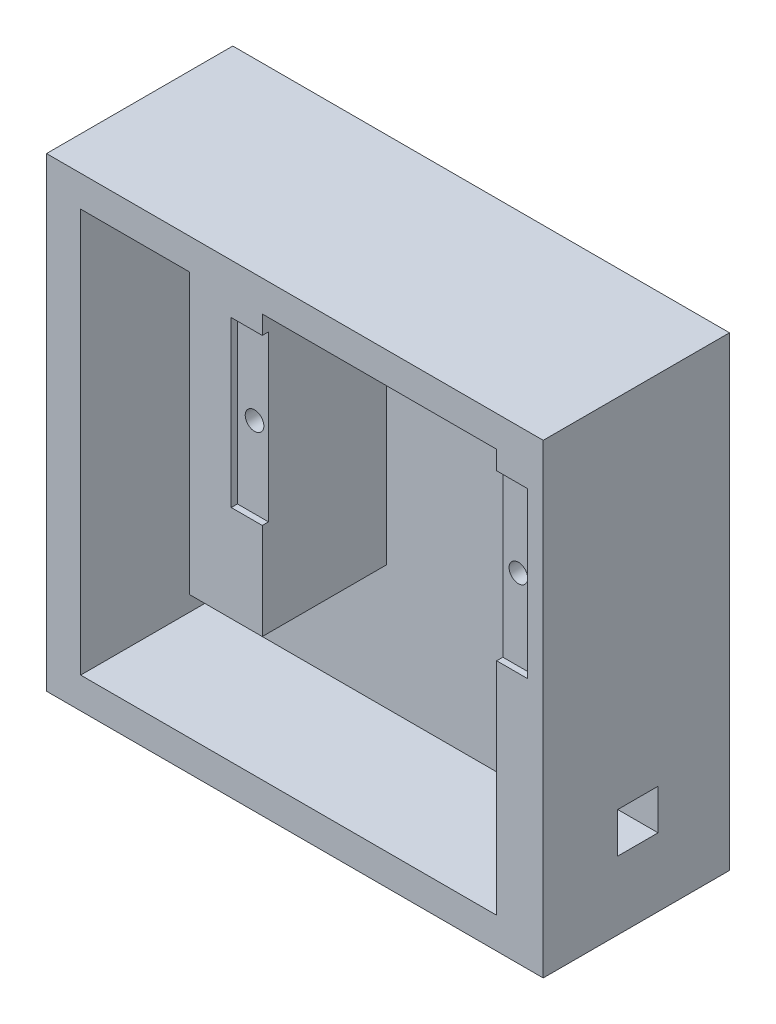
ISO-10303-21;
HEADER;
FILE_DESCRIPTION(('STEP AP214'),'2;1');
FILE_NAME('part.step','',(''),(''),'','','');
FILE_SCHEMA(('AUTOMOTIVE_DESIGN { 1 0 10303 214 1 1 1 1 }'));
ENDSEC;
DATA;
#1=APPLICATION_CONTEXT('core data for automotive mechanical design processes');
#2=APPLICATION_PROTOCOL_DEFINITION('international standard','automotive_design',2000,#1);
#3=PRODUCT_CONTEXT('',#1,'mechanical');
#4=PRODUCT('Part','Part','',(#3));
#5=PRODUCT_RELATED_PRODUCT_CATEGORY('part','',(#4));
#6=PRODUCT_DEFINITION_FORMATION('','',#4);
#7=PRODUCT_DEFINITION_CONTEXT('part definition',#1,'design');
#8=PRODUCT_DEFINITION('design','',#6,#7);
#9=PRODUCT_DEFINITION_SHAPE('','',#8);
#10=(LENGTH_UNIT() NAMED_UNIT(*) SI_UNIT(.MILLI.,.METRE.));
#11=(NAMED_UNIT(*) PLANE_ANGLE_UNIT() SI_UNIT($,.RADIAN.));
#12=(NAMED_UNIT(*) SI_UNIT($,.STERADIAN.) SOLID_ANGLE_UNIT());
#13=UNCERTAINTY_MEASURE_WITH_UNIT(LENGTH_MEASURE(1.E-05),#10,'distance_accuracy_value','');
#14=(GEOMETRIC_REPRESENTATION_CONTEXT(3) GLOBAL_UNCERTAINTY_ASSIGNED_CONTEXT((#13)) GLOBAL_UNIT_ASSIGNED_CONTEXT((#10,
#11,#12)) REPRESENTATION_CONTEXT('',''));
#15=CARTESIAN_POINT('',(0.,0.,0.));
#16=DIRECTION('',(0.,0.,1.));
#17=DIRECTION('',(1.,0.,0.));
#18=AXIS2_PLACEMENT_3D('',#15,#16,#17);
#19=CARTESIAN_POINT('',(-9.99999999999998,-43.,-8.48528137423857));
#20=DIRECTION('',(0.,0.,1.));
#21=DIRECTION('',(1.,0.,0.));
#22=AXIS2_PLACEMENT_3D('',#19,#20,#21);
#23=CYLINDRICAL_SURFACE('',#22,3.);
#24=CARTESIAN_POINT('',(-9.99999999999998,-43.,0.));
#25=DIRECTION('',(0.,0.,-1.));
#26=DIRECTION('',(-1.,0.,0.));
#27=AXIS2_PLACEMENT_3D('',#24,#25,#26);
#28=CIRCLE('',#27,3.);
#29=CARTESIAN_POINT('',(-13.,-43.,0.));
#30=VERTEX_POINT('',#29);
#31=EDGE_CURVE('E299',#30,#30,#28,.F.);
#32=ORIENTED_EDGE('',*,*,#31,.F.);
#33=EDGE_LOOP('',(#32));
#34=FACE_BOUND('',#33,.T.);
#35=CARTESIAN_POINT('',(-9.99999999999998,-43.,58.));
#36=DIRECTION('',(0.,0.,1.));
#37=DIRECTION('',(1.,0.,0.));
#38=AXIS2_PLACEMENT_3D('',#35,#36,#37);
#39=CIRCLE('',#38,3.);
#40=CARTESIAN_POINT('',(-6.99999999999998,-43.,58.));
#41=VERTEX_POINT('',#40);
#42=EDGE_CURVE('E39',#41,#41,#39,.F.);
#43=ORIENTED_EDGE('',*,*,#42,.F.);
#44=EDGE_LOOP('',(#43));
#45=FACE_BOUND('',#44,.T.);
#46=ADVANCED_FACE('F35',(#34,#45),#23,.F.);
#47=CARTESIAN_POINT('',(-95.,-43.,-8.48528137423857));
#48=DIRECTION('',(0.,0.,1.));
#49=DIRECTION('',(1.,0.,0.));
#50=AXIS2_PLACEMENT_3D('',#47,#48,#49);
#51=CYLINDRICAL_SURFACE('',#50,2.99999999999999);
#52=CARTESIAN_POINT('',(-95.,-43.,0.));
#53=DIRECTION('',(0.,0.,-1.));
#54=DIRECTION('',(-1.,0.,0.));
#55=AXIS2_PLACEMENT_3D('',#52,#53,#54);
#56=CIRCLE('',#55,2.99999999999999);
#57=CARTESIAN_POINT('',(-98.,-43.,0.));
#58=VERTEX_POINT('',#57);
#59=EDGE_CURVE('E306',#58,#58,#56,.F.);
#60=ORIENTED_EDGE('',*,*,#59,.F.);
#61=EDGE_LOOP('',(#60));
#62=FACE_BOUND('',#61,.T.);
#63=CARTESIAN_POINT('',(-95.,-43.,58.));
#64=DIRECTION('',(0.,0.,1.));
#65=DIRECTION('',(1.,0.,0.));
#66=AXIS2_PLACEMENT_3D('',#63,#64,#65);
#67=CIRCLE('',#66,2.99999999999999);
#68=CARTESIAN_POINT('',(-92.,-43.,58.));
#69=VERTEX_POINT('',#68);
#70=EDGE_CURVE('E255',#69,#69,#67,.F.);
#71=ORIENTED_EDGE('',*,*,#70,.F.);
#72=EDGE_LOOP('',(#71));
#73=FACE_BOUND('',#72,.T.);
#74=ADVANCED_FACE('F402',(#62,#73),#51,.F.);
#75=CARTESIAN_POINT('',(0.,0.,60.));
#76=DIRECTION('',(-1.,0.,0.));
#77=DIRECTION('',(0.,-1.,0.));
#78=AXIS2_PLACEMENT_3D('',#75,#76,#77);
#79=PLANE('',#78);
#80=DIRECTION('',(0.,0.,-1.));
#81=VECTOR('',#80,1.);
#82=CARTESIAN_POINT('',(0.,-128.,36.));
#83=LINE('',#82,#81);
#84=CARTESIAN_POINT('',(0.,-128.,36.));
#85=VERTEX_POINT('',#84);
#86=CARTESIAN_POINT('',(0.,-128.,23.));
#87=VERTEX_POINT('',#86);
#88=EDGE_CURVE('E287',#85,#87,#83,.T.);
#89=ORIENTED_EDGE('',*,*,#88,.F.);
#90=DIRECTION('',(0.,-1.,0.));
#91=VECTOR('',#90,1.);
#92=CARTESIAN_POINT('',(0.,-115.,36.));
#93=LINE('',#92,#91);
#94=CARTESIAN_POINT('',(0.,-115.,36.));
#95=VERTEX_POINT('',#94);
#96=EDGE_CURVE('E285',#95,#85,#93,.T.);
#97=ORIENTED_EDGE('',*,*,#96,.F.);
#98=DIRECTION('',(0.,0.,1.));
#99=VECTOR('',#98,1.);
#100=CARTESIAN_POINT('',(0.,-115.,36.));
#101=LINE('',#100,#99);
#102=CARTESIAN_POINT('',(0.,-115.,23.));
#103=VERTEX_POINT('',#102);
#104=EDGE_CURVE('E293',#103,#95,#101,.T.);
#105=ORIENTED_EDGE('',*,*,#104,.F.);
#106=DIRECTION('',(0.,1.,0.));
#107=VECTOR('',#106,1.);
#108=CARTESIAN_POINT('',(0.,-115.,23.));
#109=LINE('',#108,#107);
#110=EDGE_CURVE('E290',#87,#103,#109,.T.);
#111=ORIENTED_EDGE('',*,*,#110,.F.);
#112=EDGE_LOOP('',(#89,#97,#105,#111));
#113=FACE_BOUND('',#112,.T.);
#114=DIRECTION('',(0.,1.,0.));
#115=VECTOR('',#114,1.);
#116=CARTESIAN_POINT('',(0.,0.,0.));
#117=LINE('',#116,#115);
#118=CARTESIAN_POINT('',(0.,-150.,0.));
#119=VERTEX_POINT('',#118);
#120=CARTESIAN_POINT('',(0.,0.,0.));
#121=VERTEX_POINT('',#120);
#122=EDGE_CURVE('E346',#119,#121,#117,.T.);
#123=ORIENTED_EDGE('',*,*,#122,.T.);
#124=DIRECTION('',(0.,0.,-1.));
#125=VECTOR('',#124,1.);
#126=CARTESIAN_POINT('',(0.,0.,60.));
#127=LINE('',#126,#125);
#128=CARTESIAN_POINT('',(0.,0.,60.));
#129=VERTEX_POINT('',#128);
#130=EDGE_CURVE('E383',#129,#121,#127,.T.);
#131=ORIENTED_EDGE('',*,*,#130,.F.);
#132=DIRECTION('',(0.,1.,0.));
#133=VECTOR('',#132,1.);
#134=CARTESIAN_POINT('',(0.,0.,60.));
#135=LINE('',#134,#133);
#136=CARTESIAN_POINT('',(0.,-150.,60.));
#137=VERTEX_POINT('',#136);
#138=EDGE_CURVE('E357',#137,#129,#135,.T.);
#139=ORIENTED_EDGE('',*,*,#138,.F.);
#140=DIRECTION('',(0.,0.,-1.));
#141=VECTOR('',#140,1.);
#142=CARTESIAN_POINT('',(0.,-150.,60.));
#143=LINE('',#142,#141);
#144=EDGE_CURVE('E367',#137,#119,#143,.T.);
#145=ORIENTED_EDGE('',*,*,#144,.T.);
#146=EDGE_LOOP('',(#123,#131,#139,#145));
#147=FACE_BOUND('',#146,.T.);
#148=ADVANCED_FACE('F37',(#113,#147),#79,.F.);
#149=CARTESIAN_POINT('',(0.,0.,60.));
#150=DIRECTION('',(0.,-1.,0.));
#151=DIRECTION('',(1.,0.,0.));
#152=AXIS2_PLACEMENT_3D('',#149,#150,#151);
#153=PLANE('',#152);
#154=DIRECTION('',(-1.,0.,0.));
#155=VECTOR('',#154,1.);
#156=CARTESIAN_POINT('',(0.,0.,0.));
#157=LINE('',#156,#155);
#158=CARTESIAN_POINT('',(-160.,0.,0.));
#159=VERTEX_POINT('',#158);
#160=EDGE_CURVE('E370',#121,#159,#157,.T.);
#161=ORIENTED_EDGE('',*,*,#160,.T.);
#162=DIRECTION('',(0.,0.,-1.));
#163=VECTOR('',#162,1.);
#164=CARTESIAN_POINT('',(-160.,0.,60.));
#165=LINE('',#164,#163);
#166=CARTESIAN_POINT('',(-160.,0.,60.));
#167=VERTEX_POINT('',#166);
#168=EDGE_CURVE('E380',#167,#159,#165,.T.);
#169=ORIENTED_EDGE('',*,*,#168,.F.);
#170=DIRECTION('',(-1.,0.,0.));
#171=VECTOR('',#170,1.);
#172=CARTESIAN_POINT('',(0.,0.,60.));
#173=LINE('',#172,#171);
#174=EDGE_CURVE('E360',#129,#167,#173,.T.);
#175=ORIENTED_EDGE('',*,*,#174,.F.);
#176=ORIENTED_EDGE('',*,*,#130,.T.);
#177=EDGE_LOOP('',(#161,#169,#175,#176));
#178=FACE_BOUND('',#177,.T.);
#179=ADVANCED_FACE('F454',(#178),#153,.F.);
#180=CARTESIAN_POINT('',(-160.,0.,60.));
#181=DIRECTION('',(1.,0.,0.));
#182=DIRECTION('',(0.,1.,0.));
#183=AXIS2_PLACEMENT_3D('',#180,#181,#182);
#184=PLANE('',#183);
#185=DIRECTION('',(0.,-1.,0.));
#186=VECTOR('',#185,1.);
#187=CARTESIAN_POINT('',(-160.,0.,0.));
#188=LINE('',#187,#186);
#189=CARTESIAN_POINT('',(-160.,-150.,0.));
#190=VERTEX_POINT('',#189);
#191=EDGE_CURVE('E372',#159,#190,#188,.T.);
#192=ORIENTED_EDGE('',*,*,#191,.T.);
#193=DIRECTION('',(0.,0.,-1.));
#194=VECTOR('',#193,1.);
#195=CARTESIAN_POINT('',(-160.,-150.,60.));
#196=LINE('',#195,#194);
#197=CARTESIAN_POINT('',(-160.,-150.,60.));
#198=VERTEX_POINT('',#197);
#199=EDGE_CURVE('E377',#198,#190,#196,.T.);
#200=ORIENTED_EDGE('',*,*,#199,.F.);
#201=DIRECTION('',(0.,-1.,0.));
#202=VECTOR('',#201,1.);
#203=CARTESIAN_POINT('',(-160.,0.,60.));
#204=LINE('',#203,#202);
#205=EDGE_CURVE('E363',#167,#198,#204,.T.);
#206=ORIENTED_EDGE('',*,*,#205,.F.);
#207=ORIENTED_EDGE('',*,*,#168,.T.);
#208=EDGE_LOOP('',(#192,#200,#206,#207));
#209=FACE_BOUND('',#208,.T.);
#210=ADVANCED_FACE('F451',(#209),#184,.F.);
#211=CARTESIAN_POINT('',(0.,-150.,60.));
#212=DIRECTION('',(0.,1.,0.));
#213=DIRECTION('',(-1.,0.,0.));
#214=AXIS2_PLACEMENT_3D('',#211,#212,#213);
#215=PLANE('',#214);
#216=DIRECTION('',(1.,0.,0.));
#217=VECTOR('',#216,1.);
#218=CARTESIAN_POINT('',(0.,-150.,0.));
#219=LINE('',#218,#217);
#220=EDGE_CURVE('E361',#190,#119,#219,.T.);
#221=ORIENTED_EDGE('',*,*,#220,.T.);
#222=ORIENTED_EDGE('',*,*,#144,.F.);
#223=DIRECTION('',(1.,0.,0.));
#224=VECTOR('',#223,1.);
#225=CARTESIAN_POINT('',(0.,-150.,60.));
#226=LINE('',#225,#224);
#227=EDGE_CURVE('E365',#198,#137,#226,.T.);
#228=ORIENTED_EDGE('',*,*,#227,.F.);
#229=ORIENTED_EDGE('',*,*,#199,.T.);
#230=EDGE_LOOP('',(#221,#222,#228,#229));
#231=FACE_BOUND('',#230,.T.);
#232=ADVANCED_FACE('F444',(#231),#215,.F.);
#233=CARTESIAN_POINT('',(0.,0.,60.));
#234=DIRECTION('',(0.,0.,-1.));
#235=DIRECTION('',(-1.,0.,0.));
#236=AXIS2_PLACEMENT_3D('',#233,#234,#235);
#237=PLANE('',#236);
#238=DIRECTION('',(0.,-1.,0.));
#239=VECTOR('',#238,1.);
#240=CARTESIAN_POINT('',(-149.,-100.,60.));
#241=LINE('',#240,#239);
#242=CARTESIAN_POINT('',(-149.,-10.,60.));
#243=VERTEX_POINT('',#242);
#244=CARTESIAN_POINT('',(-149.,-140.,60.));
#245=VERTEX_POINT('',#244);
#246=EDGE_CURVE('E333',#243,#245,#241,.T.);
#247=ORIENTED_EDGE('',*,*,#246,.F.);
#248=DIRECTION('',(-1.,0.,0.));
#249=VECTOR('',#248,1.);
#250=CARTESIAN_POINT('',(-149.,-10.,60.));
#251=LINE('',#250,#249);
#252=CARTESIAN_POINT('',(-114.,-10.,60.));
#253=VERTEX_POINT('',#252);
#254=EDGE_CURVE('E212',#253,#243,#251,.T.);
#255=ORIENTED_EDGE('',*,*,#254,.F.);
#256=DIRECTION('',(0.,1.,0.));
#257=VECTOR('',#256,1.);
#258=CARTESIAN_POINT('',(-114.,-10.,60.));
#259=LINE('',#258,#257);
#260=CARTESIAN_POINT('',(-114.,-100.,60.));
#261=VERTEX_POINT('',#260);
#262=EDGE_CURVE('E218',#261,#253,#259,.T.);
#263=ORIENTED_EDGE('',*,*,#262,.F.);
#264=DIRECTION('',(-1.,0.,0.));
#265=VECTOR('',#264,1.);
#266=CARTESIAN_POINT('',(-149.,-100.,60.));
#267=LINE('',#266,#265);
#268=CARTESIAN_POINT('',(-90.5,-100.,60.));
#269=VERTEX_POINT('',#268);
#270=EDGE_CURVE('E330',#269,#261,#267,.T.);
#271=ORIENTED_EDGE('',*,*,#270,.F.);
#272=DIRECTION('',(0.,-1.,0.));
#273=VECTOR('',#272,1.);
#274=CARTESIAN_POINT('',(-90.5,-10.,60.));
#275=LINE('',#274,#273);
#276=CARTESIAN_POINT('',(-90.5,-69.,60.));
#277=VERTEX_POINT('',#276);
#278=EDGE_CURVE('E309',#277,#269,#275,.T.);
#279=ORIENTED_EDGE('',*,*,#278,.F.);
#280=DIRECTION('',(1.,0.,0.));
#281=VECTOR('',#280,1.);
#282=CARTESIAN_POINT('',(-100.5,-69.,60.));
#283=LINE('',#282,#281);
#284=CARTESIAN_POINT('',(-100.5,-69.,60.));
#285=VERTEX_POINT('',#284);
#286=EDGE_CURVE('E248',#285,#277,#283,.T.);
#287=ORIENTED_EDGE('',*,*,#286,.F.);
#288=DIRECTION('',(0.,-1.,0.));
#289=VECTOR('',#288,1.);
#290=CARTESIAN_POINT('',(-100.5,-16.,60.));
#291=LINE('',#290,#289);
#292=CARTESIAN_POINT('',(-100.5,-16.,60.));
#293=VERTEX_POINT('',#292);
#294=EDGE_CURVE('E245',#293,#285,#291,.T.);
#295=ORIENTED_EDGE('',*,*,#294,.F.);
#296=DIRECTION('',(-1.,0.,0.));
#297=VECTOR('',#296,1.);
#298=CARTESIAN_POINT('',(-100.5,-16.,60.));
#299=LINE('',#298,#297);
#300=CARTESIAN_POINT('',(-90.5,-16.,60.));
#301=VERTEX_POINT('',#300);
#302=EDGE_CURVE('E237',#301,#293,#299,.T.);
#303=ORIENTED_EDGE('',*,*,#302,.F.);
#304=CARTESIAN_POINT('',(-90.5,-10.,60.));
#305=VERTEX_POINT('',#304);
#306=EDGE_CURVE('E327',#305,#301,#275,.T.);
#307=ORIENTED_EDGE('',*,*,#306,.F.);
#308=DIRECTION('',(-1.,0.,0.));
#309=VECTOR('',#308,1.);
#310=CARTESIAN_POINT('',(-90.5,-10.,60.));
#311=LINE('',#310,#309);
#312=CARTESIAN_POINT('',(-15.,-10.,60.));
#313=VERTEX_POINT('',#312);
#314=EDGE_CURVE('E314',#313,#305,#311,.T.);
#315=ORIENTED_EDGE('',*,*,#314,.F.);
#316=DIRECTION('',(0.,1.,0.));
#317=VECTOR('',#316,1.);
#318=CARTESIAN_POINT('',(-15.,-10.,60.));
#319=LINE('',#318,#317);
#320=CARTESIAN_POINT('',(-15.,-16.,60.));
#321=VERTEX_POINT('',#320);
#322=EDGE_CURVE('E338',#321,#313,#319,.T.);
#323=ORIENTED_EDGE('',*,*,#322,.F.);
#324=DIRECTION('',(-1.,0.,0.));
#325=VECTOR('',#324,1.);
#326=CARTESIAN_POINT('',(-15.,-16.,60.));
#327=LINE('',#326,#325);
#328=CARTESIAN_POINT('',(-4.99999999999996,-16.,60.));
#329=VERTEX_POINT('',#328);
#330=EDGE_CURVE('E265',#329,#321,#327,.T.);
#331=ORIENTED_EDGE('',*,*,#330,.F.);
#332=DIRECTION('',(0.,1.,0.));
#333=VECTOR('',#332,1.);
#334=CARTESIAN_POINT('',(-4.99999999999996,-16.,60.));
#335=LINE('',#334,#333);
#336=CARTESIAN_POINT('',(-4.99999999999995,-69.,60.));
#337=VERTEX_POINT('',#336);
#338=EDGE_CURVE('E274',#337,#329,#335,.T.);
#339=ORIENTED_EDGE('',*,*,#338,.F.);
#340=DIRECTION('',(1.,0.,0.));
#341=VECTOR('',#340,1.);
#342=CARTESIAN_POINT('',(-15.,-69.,60.));
#343=LINE('',#342,#341);
#344=CARTESIAN_POINT('',(-15.,-69.,60.));
#345=VERTEX_POINT('',#344);
#346=EDGE_CURVE('E234',#345,#337,#343,.T.);
#347=ORIENTED_EDGE('',*,*,#346,.F.);
#348=CARTESIAN_POINT('',(-15.,-140.,60.));
#349=VERTEX_POINT('',#348);
#350=EDGE_CURVE('E339',#349,#345,#319,.T.);
#351=ORIENTED_EDGE('',*,*,#350,.F.);
#352=DIRECTION('',(1.,0.,0.));
#353=VECTOR('',#352,1.);
#354=CARTESIAN_POINT('',(-149.,-140.,60.));
#355=LINE('',#354,#353);
#356=EDGE_CURVE('E336',#245,#349,#355,.T.);
#357=ORIENTED_EDGE('',*,*,#356,.F.);
#358=EDGE_LOOP('',(#247,#255,#263,#271,#279,#287,#295,#303,#307,#315,#323,#331,#339,#347,#351,#357));
#359=FACE_BOUND('',#358,.T.);
#360=ORIENTED_EDGE('',*,*,#138,.T.);
#361=ORIENTED_EDGE('',*,*,#174,.T.);
#362=ORIENTED_EDGE('',*,*,#205,.T.);
#363=ORIENTED_EDGE('',*,*,#227,.T.);
#364=EDGE_LOOP('',(#360,#361,#362,#363));
#365=FACE_BOUND('',#364,.T.);
#366=ADVANCED_FACE('F441',(#359,#365),#237,.F.);
#367=CARTESIAN_POINT('',(0.,0.,0.));
#368=DIRECTION('',(0.,0.,-1.));
#369=DIRECTION('',(-1.,0.,0.));
#370=AXIS2_PLACEMENT_3D('',#367,#368,#369);
#371=PLANE('',#370);
#372=ORIENTED_EDGE('',*,*,#59,.T.);
#373=EDGE_LOOP('',(#372));
#374=FACE_BOUND('',#373,.T.);
#375=ORIENTED_EDGE('',*,*,#31,.T.);
#376=EDGE_LOOP('',(#375));
#377=FACE_BOUND('',#376,.T.);
#378=ORIENTED_EDGE('',*,*,#122,.F.);
#379=ORIENTED_EDGE('',*,*,#220,.F.);
#380=ORIENTED_EDGE('',*,*,#191,.F.);
#381=ORIENTED_EDGE('',*,*,#160,.F.);
#382=EDGE_LOOP('',(#378,#379,#380,#381));
#383=FACE_BOUND('',#382,.T.);
#384=ADVANCED_FACE('F439',(#374,#377,#383),#371,.T.);
#385=CARTESIAN_POINT('',(-90.5,-10.,20.));
#386=DIRECTION('',(-1.,0.,0.));
#387=DIRECTION('',(0.,-1.,0.));
#388=AXIS2_PLACEMENT_3D('',#385,#386,#387);
#389=PLANE('',#388);
#390=ORIENTED_EDGE('',*,*,#306,.T.);
#391=DIRECTION('',(0.,0.,1.));
#392=VECTOR('',#391,1.);
#393=CARTESIAN_POINT('',(-90.5,-16.,58.));
#394=LINE('',#393,#392);
#395=CARTESIAN_POINT('',(-90.5,-16.,58.));
#396=VERTEX_POINT('',#395);
#397=EDGE_CURVE('E256',#396,#301,#394,.T.);
#398=ORIENTED_EDGE('',*,*,#397,.F.);
#399=DIRECTION('',(0.,1.,0.));
#400=VECTOR('',#399,1.);
#401=CARTESIAN_POINT('',(-90.5,-16.,58.));
#402=LINE('',#401,#400);
#403=CARTESIAN_POINT('',(-90.5,-69.,58.));
#404=VERTEX_POINT('',#403);
#405=EDGE_CURVE('E239',#404,#396,#402,.T.);
#406=ORIENTED_EDGE('',*,*,#405,.F.);
#407=DIRECTION('',(0.,0.,1.));
#408=VECTOR('',#407,1.);
#409=CARTESIAN_POINT('',(-90.5,-69.,58.));
#410=LINE('',#409,#408);
#411=EDGE_CURVE('E258',#404,#277,#410,.T.);
#412=ORIENTED_EDGE('',*,*,#411,.T.);
#413=ORIENTED_EDGE('',*,*,#278,.T.);
#414=DIRECTION('',(0.,0.,1.));
#415=VECTOR('',#414,1.);
#416=CARTESIAN_POINT('',(-90.5,-100.,20.));
#417=LINE('',#416,#415);
#418=CARTESIAN_POINT('',(-90.5,-100.,20.));
#419=VERTEX_POINT('',#418);
#420=EDGE_CURVE('E326',#419,#269,#417,.T.);
#421=ORIENTED_EDGE('',*,*,#420,.F.);
#422=DIRECTION('',(0.,-1.,0.));
#423=VECTOR('',#422,1.);
#424=CARTESIAN_POINT('',(-90.5,-10.,20.));
#425=LINE('',#424,#423);
#426=CARTESIAN_POINT('',(-90.5,-10.,20.));
#427=VERTEX_POINT('',#426);
#428=EDGE_CURVE('E312',#427,#419,#425,.T.);
#429=ORIENTED_EDGE('',*,*,#428,.F.);
#430=DIRECTION('',(0.,0.,1.));
#431=VECTOR('',#430,1.);
#432=CARTESIAN_POINT('',(-90.5,-10.,20.));
#433=LINE('',#432,#431);
#434=EDGE_CURVE('E344',#427,#305,#433,.T.);
#435=ORIENTED_EDGE('',*,*,#434,.T.);
#436=EDGE_LOOP('',(#390,#398,#406,#412,#413,#421,#429,#435));
#437=FACE_BOUND('',#436,.T.);
#438=ADVANCED_FACE('F421',(#437),#389,.F.);
#439=CARTESIAN_POINT('',(-90.5,-10.,20.));
#440=DIRECTION('',(0.,1.,0.));
#441=DIRECTION('',(0.,0.,1.));
#442=AXIS2_PLACEMENT_3D('',#439,#440,#441);
#443=PLANE('',#442);
#444=ORIENTED_EDGE('',*,*,#314,.T.);
#445=ORIENTED_EDGE('',*,*,#434,.F.);
#446=DIRECTION('',(-1.,0.,0.));
#447=VECTOR('',#446,1.);
#448=CARTESIAN_POINT('',(-90.5,-10.,20.));
#449=LINE('',#448,#447);
#450=CARTESIAN_POINT('',(-15.,-10.,20.));
#451=VERTEX_POINT('',#450);
#452=EDGE_CURVE('E323',#451,#427,#449,.T.);
#453=ORIENTED_EDGE('',*,*,#452,.F.);
#454=DIRECTION('',(0.,0.,1.));
#455=VECTOR('',#454,1.);
#456=CARTESIAN_POINT('',(-15.,-10.,20.));
#457=LINE('',#456,#455);
#458=EDGE_CURVE('E347',#451,#313,#457,.T.);
#459=ORIENTED_EDGE('',*,*,#458,.T.);
#460=EDGE_LOOP('',(#444,#445,#453,#459));
#461=FACE_BOUND('',#460,.T.);
#462=ADVANCED_FACE('F417',(#461),#443,.F.);
#463=CARTESIAN_POINT('',(-15.,-10.,20.));
#464=DIRECTION('',(1.,0.,0.));
#465=DIRECTION('',(0.,1.,0.));
#466=AXIS2_PLACEMENT_3D('',#463,#464,#465);
#467=PLANE('',#466);
#468=DIRECTION('',(0.,0.,1.));
#469=VECTOR('',#468,1.);
#470=CARTESIAN_POINT('',(-15.,-115.,20.));
#471=LINE('',#470,#469);
#472=CARTESIAN_POINT('',(-15.,-115.,23.));
#473=VERTEX_POINT('',#472);
#474=CARTESIAN_POINT('',(-15.,-115.,36.));
#475=VERTEX_POINT('',#474);
#476=EDGE_CURVE('E44',#473,#475,#471,.T.);
#477=ORIENTED_EDGE('',*,*,#476,.T.);
#478=DIRECTION('',(0.,-1.,0.));
#479=VECTOR('',#478,1.);
#480=CARTESIAN_POINT('',(-15.,-10.,36.));
#481=LINE('',#480,#479);
#482=CARTESIAN_POINT('',(-15.,-128.,36.));
#483=VERTEX_POINT('',#482);
#484=EDGE_CURVE('E11',#475,#483,#481,.T.);
#485=ORIENTED_EDGE('',*,*,#484,.T.);
#486=DIRECTION('',(0.,0.,-1.));
#487=VECTOR('',#486,1.);
#488=CARTESIAN_POINT('',(-15.,-128.,20.));
#489=LINE('',#488,#487);
#490=CARTESIAN_POINT('',(-15.,-128.,23.));
#491=VERTEX_POINT('',#490);
#492=EDGE_CURVE('E386',#483,#491,#489,.T.);
#493=ORIENTED_EDGE('',*,*,#492,.T.);
#494=DIRECTION('',(0.,1.,0.));
#495=VECTOR('',#494,1.);
#496=CARTESIAN_POINT('',(-15.,-10.,23.));
#497=LINE('',#496,#495);
#498=EDGE_CURVE('E389',#491,#473,#497,.T.);
#499=ORIENTED_EDGE('',*,*,#498,.T.);
#500=EDGE_LOOP('',(#477,#485,#493,#499));
#501=FACE_BOUND('',#500,.T.);
#502=DIRECTION('',(0.,-1.,0.));
#503=VECTOR('',#502,1.);
#504=CARTESIAN_POINT('',(-15.,-16.,58.));
#505=LINE('',#504,#503);
#506=CARTESIAN_POINT('',(-15.,-16.,58.));
#507=VERTEX_POINT('',#506);
#508=CARTESIAN_POINT('',(-15.,-69.,58.));
#509=VERTEX_POINT('',#508);
#510=EDGE_CURVE('E262',#507,#509,#505,.T.);
#511=ORIENTED_EDGE('',*,*,#510,.F.);
#512=DIRECTION('',(0.,0.,1.));
#513=VECTOR('',#512,1.);
#514=CARTESIAN_POINT('',(-15.,-16.,58.));
#515=LINE('',#514,#513);
#516=EDGE_CURVE('E249',#507,#321,#515,.T.);
#517=ORIENTED_EDGE('',*,*,#516,.T.);
#518=ORIENTED_EDGE('',*,*,#322,.T.);
#519=ORIENTED_EDGE('',*,*,#458,.F.);
#520=DIRECTION('',(0.,1.,0.));
#521=VECTOR('',#520,1.);
#522=CARTESIAN_POINT('',(-15.,-10.,20.));
#523=LINE('',#522,#521);
#524=CARTESIAN_POINT('',(-15.,-140.,20.));
#525=VERTEX_POINT('',#524);
#526=EDGE_CURVE('E320',#525,#451,#523,.T.);
#527=ORIENTED_EDGE('',*,*,#526,.F.);
#528=DIRECTION('',(0.,0.,1.));
#529=VECTOR('',#528,1.);
#530=CARTESIAN_POINT('',(-15.,-140.,20.));
#531=LINE('',#530,#529);
#532=EDGE_CURVE('E350',#525,#349,#531,.T.);
#533=ORIENTED_EDGE('',*,*,#532,.T.);
#534=ORIENTED_EDGE('',*,*,#350,.T.);
#535=DIRECTION('',(0.,0.,1.));
#536=VECTOR('',#535,1.);
#537=CARTESIAN_POINT('',(-15.,-69.,58.));
#538=LINE('',#537,#536);
#539=EDGE_CURVE('E271',#509,#345,#538,.T.);
#540=ORIENTED_EDGE('',*,*,#539,.F.);
#541=EDGE_LOOP('',(#511,#517,#518,#519,#527,#533,#534,#540));
#542=FACE_BOUND('',#541,.T.);
#543=ADVANCED_FACE('F420',(#501,#542),#467,.F.);
#544=CARTESIAN_POINT('',(-149.,-140.,20.));
#545=DIRECTION('',(0.,-1.,0.));
#546=DIRECTION('',(0.,0.,-1.));
#547=AXIS2_PLACEMENT_3D('',#544,#545,#546);
#548=PLANE('',#547);
#549=ORIENTED_EDGE('',*,*,#532,.F.);
#550=DIRECTION('',(1.,0.,0.));
#551=VECTOR('',#550,1.);
#552=CARTESIAN_POINT('',(-149.,-140.,20.));
#553=LINE('',#552,#551);
#554=CARTESIAN_POINT('',(-149.,-140.,20.));
#555=VERTEX_POINT('',#554);
#556=EDGE_CURVE('E318',#555,#525,#553,.T.);
#557=ORIENTED_EDGE('',*,*,#556,.F.);
#558=DIRECTION('',(0.,0.,1.));
#559=VECTOR('',#558,1.);
#560=CARTESIAN_POINT('',(-149.,-140.,20.));
#561=LINE('',#560,#559);
#562=EDGE_CURVE('E353',#555,#245,#561,.T.);
#563=ORIENTED_EDGE('',*,*,#562,.T.);
#564=ORIENTED_EDGE('',*,*,#356,.T.);
#565=EDGE_LOOP('',(#549,#557,#563,#564));
#566=FACE_BOUND('',#565,.T.);
#567=ADVANCED_FACE('F425',(#566),#548,.F.);
#568=CARTESIAN_POINT('',(-149.,-100.,20.));
#569=DIRECTION('',(-1.,0.,0.));
#570=DIRECTION('',(0.,0.,1.));
#571=AXIS2_PLACEMENT_3D('',#568,#569,#570);
#572=PLANE('',#571);
#573=ORIENTED_EDGE('',*,*,#246,.T.);
#574=ORIENTED_EDGE('',*,*,#562,.F.);
#575=DIRECTION('',(0.,-1.,0.));
#576=VECTOR('',#575,1.);
#577=CARTESIAN_POINT('',(-149.,-100.,20.));
#578=LINE('',#577,#576);
#579=CARTESIAN_POINT('',(-149.,-10.,20.));
#580=VERTEX_POINT('',#579);
#581=EDGE_CURVE('E316',#580,#555,#578,.T.);
#582=ORIENTED_EDGE('',*,*,#581,.F.);
#583=DIRECTION('',(0.,0.,1.));
#584=VECTOR('',#583,1.);
#585=CARTESIAN_POINT('',(-149.,-10.,20.));
#586=LINE('',#585,#584);
#587=EDGE_CURVE('E222',#580,#243,#586,.T.);
#588=ORIENTED_EDGE('',*,*,#587,.T.);
#589=EDGE_LOOP('',(#573,#574,#582,#588));
#590=FACE_BOUND('',#589,.T.);
#591=ADVANCED_FACE('F429',(#590),#572,.F.);
#592=CARTESIAN_POINT('',(-149.,-100.,20.));
#593=DIRECTION('',(0.,1.,0.));
#594=DIRECTION('',(0.,0.,1.));
#595=AXIS2_PLACEMENT_3D('',#592,#593,#594);
#596=PLANE('',#595);
#597=ORIENTED_EDGE('',*,*,#270,.T.);
#598=DIRECTION('',(0.,0.,-1.));
#599=VECTOR('',#598,1.);
#600=CARTESIAN_POINT('',(-114.,-100.,20.));
#601=LINE('',#600,#599);
#602=CARTESIAN_POINT('',(-114.,-100.,20.));
#603=VERTEX_POINT('',#602);
#604=EDGE_CURVE('E231',#261,#603,#601,.T.);
#605=ORIENTED_EDGE('',*,*,#604,.T.);
#606=DIRECTION('',(-1.,0.,0.));
#607=VECTOR('',#606,1.);
#608=CARTESIAN_POINT('',(-149.,-100.,20.));
#609=LINE('',#608,#607);
#610=EDGE_CURVE('E209',#419,#603,#609,.T.);
#611=ORIENTED_EDGE('',*,*,#610,.F.);
#612=ORIENTED_EDGE('',*,*,#420,.T.);
#613=EDGE_LOOP('',(#597,#605,#611,#612));
#614=FACE_BOUND('',#613,.T.);
#615=ADVANCED_FACE('F416',(#614),#596,.F.);
#616=CARTESIAN_POINT('',(0.,0.,20.));
#617=DIRECTION('',(0.,0.,1.));
#618=DIRECTION('',(1.,0.,0.));
#619=AXIS2_PLACEMENT_3D('',#616,#617,#618);
#620=PLANE('',#619);
#621=ORIENTED_EDGE('',*,*,#610,.T.);
#622=DIRECTION('',(0.,1.,0.));
#623=VECTOR('',#622,1.);
#624=CARTESIAN_POINT('',(-114.,-10.,20.));
#625=LINE('',#624,#623);
#626=CARTESIAN_POINT('',(-114.,-10.,20.));
#627=VERTEX_POINT('',#626);
#628=EDGE_CURVE('E201',#603,#627,#625,.T.);
#629=ORIENTED_EDGE('',*,*,#628,.T.);
#630=DIRECTION('',(-1.,0.,0.));
#631=VECTOR('',#630,1.);
#632=CARTESIAN_POINT('',(-149.,-10.,20.));
#633=LINE('',#632,#631);
#634=EDGE_CURVE('E206',#627,#580,#633,.T.);
#635=ORIENTED_EDGE('',*,*,#634,.T.);
#636=ORIENTED_EDGE('',*,*,#581,.T.);
#637=ORIENTED_EDGE('',*,*,#556,.T.);
#638=ORIENTED_EDGE('',*,*,#526,.T.);
#639=ORIENTED_EDGE('',*,*,#452,.T.);
#640=ORIENTED_EDGE('',*,*,#428,.T.);
#641=EDGE_LOOP('',(#621,#629,#635,#636,#637,#638,#639,#640));
#642=FACE_BOUND('',#641,.T.);
#643=ADVANCED_FACE('F203',(#642),#620,.T.);
#644=CARTESIAN_POINT('',(-50.,-115.,36.));
#645=DIRECTION('',(0.,0.,1.));
#646=DIRECTION('',(1.,0.,0.));
#647=AXIS2_PLACEMENT_3D('',#644,#645,#646);
#648=PLANE('',#647);
#649=DIRECTION('',(1.,0.,0.));
#650=VECTOR('',#649,1.);
#651=CARTESIAN_POINT('',(-50.,-115.,36.));
#652=LINE('',#651,#650);
#653=EDGE_CURVE('E297',#475,#95,#652,.T.);
#654=ORIENTED_EDGE('',*,*,#653,.T.);
#655=ORIENTED_EDGE('',*,*,#96,.T.);
#656=DIRECTION('',(1.,0.,0.));
#657=VECTOR('',#656,1.);
#658=CARTESIAN_POINT('',(-50.,-128.,36.));
#659=LINE('',#658,#657);
#660=EDGE_CURVE('E296',#483,#85,#659,.T.);
#661=ORIENTED_EDGE('',*,*,#660,.F.);
#662=ORIENTED_EDGE('',*,*,#484,.F.);
#663=EDGE_LOOP('',(#654,#655,#661,#662));
#664=FACE_BOUND('',#663,.T.);
#665=ADVANCED_FACE('F415',(#664),#648,.F.);
#666=CARTESIAN_POINT('',(-50.,-115.,36.));
#667=DIRECTION('',(0.,1.,0.));
#668=DIRECTION('',(-1.,0.,0.));
#669=AXIS2_PLACEMENT_3D('',#666,#667,#668);
#670=PLANE('',#669);
#671=DIRECTION('',(1.,0.,0.));
#672=VECTOR('',#671,1.);
#673=CARTESIAN_POINT('',(-50.,-115.,23.));
#674=LINE('',#673,#672);
#675=EDGE_CURVE('E300',#473,#103,#674,.T.);
#676=ORIENTED_EDGE('',*,*,#675,.T.);
#677=ORIENTED_EDGE('',*,*,#104,.T.);
#678=ORIENTED_EDGE('',*,*,#653,.F.);
#679=ORIENTED_EDGE('',*,*,#476,.F.);
#680=EDGE_LOOP('',(#676,#677,#678,#679));
#681=FACE_BOUND('',#680,.T.);
#682=ADVANCED_FACE('F490',(#681),#670,.F.);
#683=CARTESIAN_POINT('',(-50.,-115.,23.));
#684=DIRECTION('',(0.,0.,-1.));
#685=DIRECTION('',(0.,1.,0.));
#686=AXIS2_PLACEMENT_3D('',#683,#684,#685);
#687=PLANE('',#686);
#688=DIRECTION('',(1.,0.,0.));
#689=VECTOR('',#688,1.);
#690=CARTESIAN_POINT('',(-50.,-128.,23.));
#691=LINE('',#690,#689);
#692=EDGE_CURVE('E302',#491,#87,#691,.T.);
#693=ORIENTED_EDGE('',*,*,#692,.T.);
#694=ORIENTED_EDGE('',*,*,#110,.T.);
#695=ORIENTED_EDGE('',*,*,#675,.F.);
#696=ORIENTED_EDGE('',*,*,#498,.F.);
#697=EDGE_LOOP('',(#693,#694,#695,#696));
#698=FACE_BOUND('',#697,.T.);
#699=ADVANCED_FACE('F492',(#698),#687,.F.);
#700=CARTESIAN_POINT('',(-50.,-128.,36.));
#701=DIRECTION('',(0.,-1.,0.));
#702=DIRECTION('',(1.,0.,0.));
#703=AXIS2_PLACEMENT_3D('',#700,#701,#702);
#704=PLANE('',#703);
#705=ORIENTED_EDGE('',*,*,#660,.T.);
#706=ORIENTED_EDGE('',*,*,#88,.T.);
#707=ORIENTED_EDGE('',*,*,#692,.F.);
#708=ORIENTED_EDGE('',*,*,#492,.F.);
#709=EDGE_LOOP('',(#705,#706,#707,#708));
#710=FACE_BOUND('',#709,.T.);
#711=ADVANCED_FACE('F482',(#710),#704,.F.);
#712=CARTESIAN_POINT('',(0.,0.,58.));
#713=DIRECTION('',(0.,0.,1.));
#714=DIRECTION('',(1.,0.,0.));
#715=AXIS2_PLACEMENT_3D('',#712,#713,#714);
#716=PLANE('',#715);
#717=DIRECTION('',(0.,-1.,0.));
#718=VECTOR('',#717,1.);
#719=CARTESIAN_POINT('',(-100.5,-16.,58.));
#720=LINE('',#719,#718);
#721=CARTESIAN_POINT('',(-100.5,-16.,58.));
#722=VERTEX_POINT('',#721);
#723=CARTESIAN_POINT('',(-100.5,-69.,58.));
#724=VERTEX_POINT('',#723);
#725=EDGE_CURVE('E235',#722,#724,#720,.T.);
#726=ORIENTED_EDGE('',*,*,#725,.T.);
#727=DIRECTION('',(1.,0.,0.));
#728=VECTOR('',#727,1.);
#729=CARTESIAN_POINT('',(-100.5,-69.,58.));
#730=LINE('',#729,#728);
#731=EDGE_CURVE('E52',#724,#404,#730,.T.);
#732=ORIENTED_EDGE('',*,*,#731,.T.);
#733=ORIENTED_EDGE('',*,*,#405,.T.);
#734=DIRECTION('',(-1.,0.,0.));
#735=VECTOR('',#734,1.);
#736=CARTESIAN_POINT('',(-100.5,-16.,58.));
#737=LINE('',#736,#735);
#738=EDGE_CURVE('E241',#396,#722,#737,.T.);
#739=ORIENTED_EDGE('',*,*,#738,.T.);
#740=EDGE_LOOP('',(#726,#732,#733,#739));
#741=FACE_BOUND('',#740,.T.);
#742=ORIENTED_EDGE('',*,*,#70,.T.);
#743=EDGE_LOOP('',(#742));
#744=FACE_BOUND('',#743,.T.);
#745=ADVANCED_FACE('F499',(#741,#744),#716,.T.);
#746=CARTESIAN_POINT('',(-100.5,-16.,58.));
#747=DIRECTION('',(-1.,0.,0.));
#748=DIRECTION('',(0.,0.,1.));
#749=AXIS2_PLACEMENT_3D('',#746,#747,#748);
#750=PLANE('',#749);
#751=ORIENTED_EDGE('',*,*,#294,.T.);
#752=DIRECTION('',(0.,0.,1.));
#753=VECTOR('',#752,1.);
#754=CARTESIAN_POINT('',(-100.5,-69.,58.));
#755=LINE('',#754,#753);
#756=EDGE_CURVE('E244',#724,#285,#755,.T.);
#757=ORIENTED_EDGE('',*,*,#756,.F.);
#758=ORIENTED_EDGE('',*,*,#725,.F.);
#759=DIRECTION('',(0.,0.,1.));
#760=VECTOR('',#759,1.);
#761=CARTESIAN_POINT('',(-100.5,-16.,58.));
#762=LINE('',#761,#760);
#763=EDGE_CURVE('E253',#722,#293,#762,.T.);
#764=ORIENTED_EDGE('',*,*,#763,.T.);
#765=EDGE_LOOP('',(#751,#757,#758,#764));
#766=FACE_BOUND('',#765,.T.);
#767=ADVANCED_FACE('F556',(#766),#750,.F.);
#768=CARTESIAN_POINT('',(-100.5,-16.,58.));
#769=DIRECTION('',(0.,1.,0.));
#770=DIRECTION('',(-1.,0.,0.));
#771=AXIS2_PLACEMENT_3D('',#768,#769,#770);
#772=PLANE('',#771);
#773=ORIENTED_EDGE('',*,*,#302,.T.);
#774=ORIENTED_EDGE('',*,*,#763,.F.);
#775=ORIENTED_EDGE('',*,*,#738,.F.);
#776=ORIENTED_EDGE('',*,*,#397,.T.);
#777=EDGE_LOOP('',(#773,#774,#775,#776));
#778=FACE_BOUND('',#777,.T.);
#779=ADVANCED_FACE('F565',(#778),#772,.F.);
#780=CARTESIAN_POINT('',(-100.5,-69.,58.));
#781=DIRECTION('',(0.,-1.,0.));
#782=DIRECTION('',(0.,0.,-1.));
#783=AXIS2_PLACEMENT_3D('',#780,#781,#782);
#784=PLANE('',#783);
#785=ORIENTED_EDGE('',*,*,#286,.T.);
#786=ORIENTED_EDGE('',*,*,#411,.F.);
#787=ORIENTED_EDGE('',*,*,#731,.F.);
#788=ORIENTED_EDGE('',*,*,#756,.T.);
#789=EDGE_LOOP('',(#785,#786,#787,#788));
#790=FACE_BOUND('',#789,.T.);
#791=ADVANCED_FACE('F575',(#790),#784,.F.);
#792=CARTESIAN_POINT('',(0.,0.,58.));
#793=DIRECTION('',(0.,0.,1.));
#794=DIRECTION('',(1.,0.,0.));
#795=AXIS2_PLACEMENT_3D('',#792,#793,#794);
#796=PLANE('',#795);
#797=ORIENTED_EDGE('',*,*,#510,.T.);
#798=DIRECTION('',(1.,0.,0.));
#799=VECTOR('',#798,1.);
#800=CARTESIAN_POINT('',(-15.,-69.,58.));
#801=LINE('',#800,#799);
#802=CARTESIAN_POINT('',(-4.99999999999995,-69.,58.));
#803=VERTEX_POINT('',#802);
#804=EDGE_CURVE('E264',#509,#803,#801,.T.);
#805=ORIENTED_EDGE('',*,*,#804,.T.);
#806=DIRECTION('',(0.,1.,0.));
#807=VECTOR('',#806,1.);
#808=CARTESIAN_POINT('',(-4.99999999999996,-16.,58.));
#809=LINE('',#808,#807);
#810=CARTESIAN_POINT('',(-4.99999999999996,-16.,58.));
#811=VERTEX_POINT('',#810);
#812=EDGE_CURVE('E268',#803,#811,#809,.T.);
#813=ORIENTED_EDGE('',*,*,#812,.T.);
#814=DIRECTION('',(-1.,0.,0.));
#815=VECTOR('',#814,1.);
#816=CARTESIAN_POINT('',(-15.,-16.,58.));
#817=LINE('',#816,#815);
#818=EDGE_CURVE('E60',#811,#507,#817,.T.);
#819=ORIENTED_EDGE('',*,*,#818,.T.);
#820=EDGE_LOOP('',(#797,#805,#813,#819));
#821=FACE_BOUND('',#820,.T.);
#822=ORIENTED_EDGE('',*,*,#42,.T.);
#823=EDGE_LOOP('',(#822));
#824=FACE_BOUND('',#823,.T.);
#825=ADVANCED_FACE('F399',(#821,#824),#796,.T.);
#826=CARTESIAN_POINT('',(-15.,-16.,58.));
#827=DIRECTION('',(0.,1.,0.));
#828=DIRECTION('',(0.,0.,1.));
#829=AXIS2_PLACEMENT_3D('',#826,#827,#828);
#830=PLANE('',#829);
#831=ORIENTED_EDGE('',*,*,#330,.T.);
#832=ORIENTED_EDGE('',*,*,#516,.F.);
#833=ORIENTED_EDGE('',*,*,#818,.F.);
#834=DIRECTION('',(0.,0.,1.));
#835=VECTOR('',#834,1.);
#836=CARTESIAN_POINT('',(-4.99999999999996,-16.,58.));
#837=LINE('',#836,#835);
#838=EDGE_CURVE('E280',#811,#329,#837,.T.);
#839=ORIENTED_EDGE('',*,*,#838,.T.);
#840=EDGE_LOOP('',(#831,#832,#833,#839));
#841=FACE_BOUND('',#840,.T.);
#842=ADVANCED_FACE('F594',(#841),#830,.F.);
#843=CARTESIAN_POINT('',(-4.99999999999996,-16.,58.));
#844=DIRECTION('',(1.,0.,0.));
#845=DIRECTION('',(0.,1.,0.));
#846=AXIS2_PLACEMENT_3D('',#843,#844,#845);
#847=PLANE('',#846);
#848=ORIENTED_EDGE('',*,*,#338,.T.);
#849=ORIENTED_EDGE('',*,*,#838,.F.);
#850=ORIENTED_EDGE('',*,*,#812,.F.);
#851=DIRECTION('',(0.,0.,1.));
#852=VECTOR('',#851,1.);
#853=CARTESIAN_POINT('',(-4.99999999999995,-69.,58.));
#854=LINE('',#853,#852);
#855=EDGE_CURVE('E282',#803,#337,#854,.T.);
#856=ORIENTED_EDGE('',*,*,#855,.T.);
#857=EDGE_LOOP('',(#848,#849,#850,#856));
#858=FACE_BOUND('',#857,.T.);
#859=ADVANCED_FACE('F603',(#858),#847,.F.);
#860=CARTESIAN_POINT('',(-15.,-69.,58.));
#861=DIRECTION('',(0.,-1.,0.));
#862=DIRECTION('',(0.,0.,-1.));
#863=AXIS2_PLACEMENT_3D('',#860,#861,#862);
#864=PLANE('',#863);
#865=ORIENTED_EDGE('',*,*,#346,.T.);
#866=ORIENTED_EDGE('',*,*,#855,.F.);
#867=ORIENTED_EDGE('',*,*,#804,.F.);
#868=ORIENTED_EDGE('',*,*,#539,.T.);
#869=EDGE_LOOP('',(#865,#866,#867,#868));
#870=FACE_BOUND('',#869,.T.);
#871=ADVANCED_FACE('F613',(#870),#864,.F.);
#872=CARTESIAN_POINT('',(-114.,-10.,20.));
#873=DIRECTION('',(1.,0.,0.));
#874=DIRECTION('',(0.,1.,0.));
#875=AXIS2_PLACEMENT_3D('',#872,#873,#874);
#876=PLANE('',#875);
#877=ORIENTED_EDGE('',*,*,#262,.T.);
#878=DIRECTION('',(0.,0.,1.));
#879=VECTOR('',#878,1.);
#880=CARTESIAN_POINT('',(-114.,-10.,20.));
#881=LINE('',#880,#879);
#882=EDGE_CURVE('E215',#627,#253,#881,.T.);
#883=ORIENTED_EDGE('',*,*,#882,.F.);
#884=ORIENTED_EDGE('',*,*,#628,.F.);
#885=ORIENTED_EDGE('',*,*,#604,.F.);
#886=EDGE_LOOP('',(#877,#883,#884,#885));
#887=FACE_BOUND('',#886,.T.);
#888=ADVANCED_FACE('F216',(#887),#876,.F.);
#889=CARTESIAN_POINT('',(-149.,-10.,20.));
#890=DIRECTION('',(0.,1.,0.));
#891=DIRECTION('',(-1.,0.,0.));
#892=AXIS2_PLACEMENT_3D('',#889,#890,#891);
#893=PLANE('',#892);
#894=ORIENTED_EDGE('',*,*,#254,.T.);
#895=ORIENTED_EDGE('',*,*,#587,.F.);
#896=ORIENTED_EDGE('',*,*,#634,.F.);
#897=ORIENTED_EDGE('',*,*,#882,.T.);
#898=EDGE_LOOP('',(#894,#895,#896,#897));
#899=FACE_BOUND('',#898,.T.);
#900=ADVANCED_FACE('F225',(#899),#893,.F.);
#901=CLOSED_SHELL('',(#46,#74,#148,#179,#210,#232,#366,#384,#438,#462,#543,#567,#591,#615,#643,
#665,#682,#699,#711,#745,#767,#779,#791,#825,#842,#859,#871,#888,#900));
#902=MANIFOLD_SOLID_BREP('B2',#901);
#903=ADVANCED_BREP_SHAPE_REPRESENTATION('',(#18,#902),#14);
#904=SHAPE_DEFINITION_REPRESENTATION(#9,#903);
ENDSEC;
END-ISO-10303-21;
